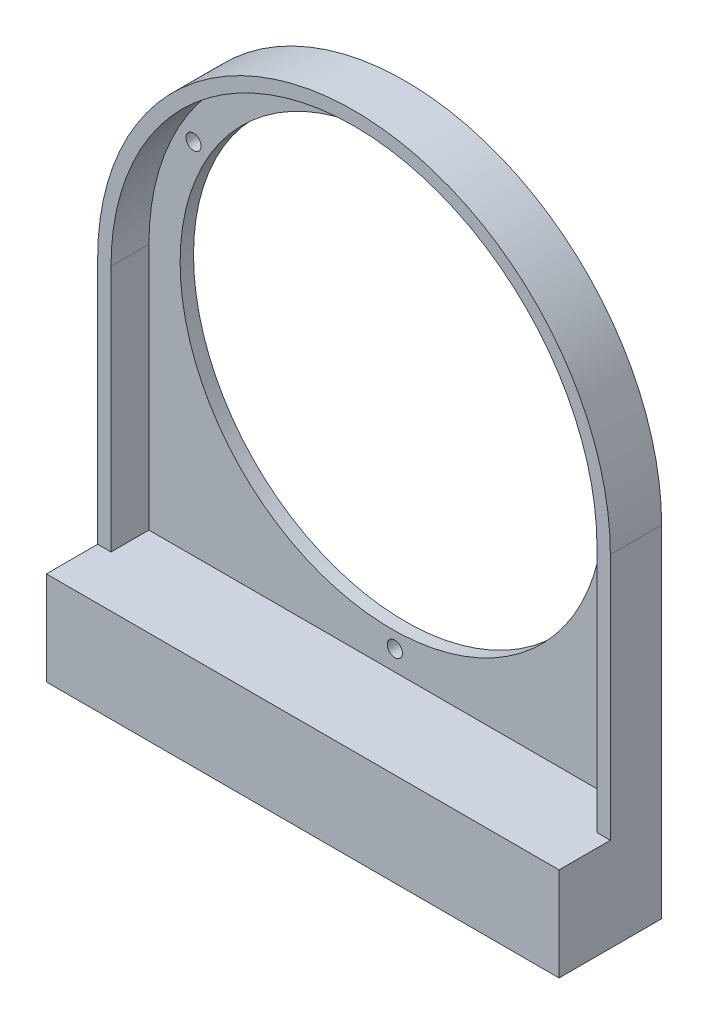
ISO-10303-21;
HEADER;
FILE_DESCRIPTION(('STEP AP214'),'2;1');
FILE_NAME('part.step','',(''),(''),'','','');
FILE_SCHEMA(('AUTOMOTIVE_DESIGN { 1 0 10303 214 1 1 1 1 }'));
ENDSEC;
DATA;
#1=APPLICATION_CONTEXT('core data for automotive mechanical design processes');
#2=APPLICATION_PROTOCOL_DEFINITION('international standard','automotive_design',2000,#1);
#3=PRODUCT_CONTEXT('',#1,'mechanical');
#4=PRODUCT('Part','Part','',(#3));
#5=PRODUCT_RELATED_PRODUCT_CATEGORY('part','',(#4));
#6=PRODUCT_DEFINITION_FORMATION('','',#4);
#7=PRODUCT_DEFINITION_CONTEXT('part definition',#1,'design');
#8=PRODUCT_DEFINITION('design','',#6,#7);
#9=PRODUCT_DEFINITION_SHAPE('','',#8);
#10=(LENGTH_UNIT() NAMED_UNIT(*) SI_UNIT(.MILLI.,.METRE.));
#11=(NAMED_UNIT(*) PLANE_ANGLE_UNIT() SI_UNIT($,.RADIAN.));
#12=(NAMED_UNIT(*) SI_UNIT($,.STERADIAN.) SOLID_ANGLE_UNIT());
#13=UNCERTAINTY_MEASURE_WITH_UNIT(LENGTH_MEASURE(1.E-05),#10,'distance_accuracy_value','');
#14=(GEOMETRIC_REPRESENTATION_CONTEXT(3) GLOBAL_UNCERTAINTY_ASSIGNED_CONTEXT((#13)) GLOBAL_UNIT_ASSIGNED_CONTEXT((#10,
#11,#12)) REPRESENTATION_CONTEXT('',''));
#15=CARTESIAN_POINT('',(0.,0.,0.));
#16=DIRECTION('',(0.,0.,1.));
#17=DIRECTION('',(1.,0.,0.));
#18=AXIS2_PLACEMENT_3D('',#15,#16,#17);
#19=CARTESIAN_POINT('',(0.,76.5,11.5));
#20=DIRECTION('',(0.,0.,-1.));
#21=DIRECTION('',(-1.,0.,0.));
#22=AXIS2_PLACEMENT_3D('',#19,#20,#21);
#23=PLANE('',#22);
#24=DIRECTION('',(0.,1.,0.));
#25=VECTOR('',#24,1.);
#26=CARTESIAN_POINT('',(-54.5,21.,11.5));
#27=LINE('',#26,#25);
#28=CARTESIAN_POINT('',(-54.5,21.,11.5));
#29=VERTEX_POINT('',#28);
#30=CARTESIAN_POINT('',(-54.5,76.5,11.5));
#31=VERTEX_POINT('',#30);
#32=EDGE_CURVE('E50',#29,#31,#27,.T.);
#33=ORIENTED_EDGE('',*,*,#32,.T.);
#34=CARTESIAN_POINT('',(0.,76.5,11.5));
#35=DIRECTION('',(0.,0.,-1.));
#36=DIRECTION('',(-1.,0.,0.));
#37=AXIS2_PLACEMENT_3D('',#34,#35,#36);
#38=CIRCLE('',#37,54.5);
#39=CARTESIAN_POINT('',(54.5,76.5,11.5));
#40=VERTEX_POINT('',#39);
#41=EDGE_CURVE('E132',#31,#40,#38,.T.);
#42=ORIENTED_EDGE('',*,*,#41,.T.);
#43=DIRECTION('',(0.,-1.,0.));
#44=VECTOR('',#43,1.);
#45=CARTESIAN_POINT('',(54.5,76.5,11.5));
#46=LINE('',#45,#44);
#47=CARTESIAN_POINT('',(54.5,21.,11.5));
#48=VERTEX_POINT('',#47);
#49=EDGE_CURVE('E128',#40,#48,#46,.T.);
#50=ORIENTED_EDGE('',*,*,#49,.T.);
#51=DIRECTION('',(-1.,0.,0.));
#52=VECTOR('',#51,1.);
#53=CARTESIAN_POINT('',(-57.5,21.,11.5));
#54=LINE('',#53,#52);
#55=CARTESIAN_POINT('',(57.5,21.,11.5));
#56=VERTEX_POINT('',#55);
#57=EDGE_CURVE('E58',#56,#48,#54,.T.);
#58=ORIENTED_EDGE('',*,*,#57,.F.);
#59=DIRECTION('',(0.,1.,0.));
#60=VECTOR('',#59,1.);
#61=CARTESIAN_POINT('',(57.5,76.5,11.5));
#62=LINE('',#61,#60);
#63=CARTESIAN_POINT('',(57.5,76.5,11.5));
#64=VERTEX_POINT('',#63);
#65=EDGE_CURVE('E229',#56,#64,#62,.T.);
#66=ORIENTED_EDGE('',*,*,#65,.T.);
#67=CARTESIAN_POINT('',(0.,76.5,11.5));
#68=DIRECTION('',(0.,0.,1.));
#69=DIRECTION('',(-1.,0.,0.));
#70=AXIS2_PLACEMENT_3D('',#67,#68,#69);
#71=CIRCLE('',#70,57.5);
#72=CARTESIAN_POINT('',(-57.5,76.5,11.5));
#73=VERTEX_POINT('',#72);
#74=EDGE_CURVE('E223',#64,#73,#71,.T.);
#75=ORIENTED_EDGE('',*,*,#74,.T.);
#76=DIRECTION('',(0.,-1.,0.));
#77=VECTOR('',#76,1.);
#78=CARTESIAN_POINT('',(-57.5,0.,11.5));
#79=LINE('',#78,#77);
#80=CARTESIAN_POINT('',(-57.5,21.,11.5));
#81=VERTEX_POINT('',#80);
#82=EDGE_CURVE('E220',#73,#81,#79,.T.);
#83=ORIENTED_EDGE('',*,*,#82,.T.);
#84=EDGE_CURVE('E133',#29,#81,#54,.T.);
#85=ORIENTED_EDGE('',*,*,#84,.F.);
#86=EDGE_LOOP('',(#33,#42,#50,#58,#66,#75,#83,#85));
#87=FACE_BOUND('',#86,.T.);
#88=ADVANCED_FACE('F33',(#87),#23,.F.);
#89=CARTESIAN_POINT('',(57.5,76.5,11.5));
#90=DIRECTION('',(-1.,0.,0.));
#91=DIRECTION('',(0.,0.,1.));
#92=AXIS2_PLACEMENT_3D('',#89,#90,#91);
#93=PLANE('',#92);
#94=DIRECTION('',(0.,1.,0.));
#95=VECTOR('',#94,1.);
#96=CARTESIAN_POINT('',(57.5,76.5,0.));
#97=LINE('',#96,#95);
#98=CARTESIAN_POINT('',(57.5,0.,0.));
#99=VERTEX_POINT('',#98);
#100=CARTESIAN_POINT('',(57.5,76.5,0.));
#101=VERTEX_POINT('',#100);
#102=EDGE_CURVE('E207',#99,#101,#97,.T.);
#103=ORIENTED_EDGE('',*,*,#102,.T.);
#104=DIRECTION('',(0.,0.,-1.));
#105=VECTOR('',#104,1.);
#106=CARTESIAN_POINT('',(57.5,76.5,11.5));
#107=LINE('',#106,#105);
#108=EDGE_CURVE('E11',#64,#101,#107,.T.);
#109=ORIENTED_EDGE('',*,*,#108,.F.);
#110=ORIENTED_EDGE('',*,*,#65,.F.);
#111=DIRECTION('',(0.,0.,-1.));
#112=VECTOR('',#111,1.);
#113=CARTESIAN_POINT('',(57.5,21.,23.));
#114=LINE('',#113,#112);
#115=CARTESIAN_POINT('',(57.5,21.,23.));
#116=VERTEX_POINT('',#115);
#117=EDGE_CURVE('E203',#116,#56,#114,.T.);
#118=ORIENTED_EDGE('',*,*,#117,.F.);
#119=DIRECTION('',(0.,1.,0.));
#120=VECTOR('',#119,1.);
#121=CARTESIAN_POINT('',(57.5,0.,23.));
#122=LINE('',#121,#120);
#123=CARTESIAN_POINT('',(57.5,0.,23.));
#124=VERTEX_POINT('',#123);
#125=EDGE_CURVE('E147',#124,#116,#122,.T.);
#126=ORIENTED_EDGE('',*,*,#125,.F.);
#127=DIRECTION('',(0.,0.,-1.));
#128=VECTOR('',#127,1.);
#129=CARTESIAN_POINT('',(57.5,0.,11.5));
#130=LINE('',#129,#128);
#131=EDGE_CURVE('E225',#124,#99,#130,.T.);
#132=ORIENTED_EDGE('',*,*,#131,.T.);
#133=EDGE_LOOP('',(#103,#109,#110,#118,#126,#132));
#134=FACE_BOUND('',#133,.T.);
#135=ADVANCED_FACE('F35',(#134),#93,.F.);
#136=CARTESIAN_POINT('',(0.,76.5,11.5));
#137=DIRECTION('',(0.,0.,-1.));
#138=DIRECTION('',(-1.,0.,0.));
#139=AXIS2_PLACEMENT_3D('',#136,#137,#138);
#140=CYLINDRICAL_SURFACE('',#139,57.5);
#141=CARTESIAN_POINT('',(0.,76.5,0.));
#142=DIRECTION('',(0.,0.,1.));
#143=DIRECTION('',(-1.,0.,0.));
#144=AXIS2_PLACEMENT_3D('',#141,#142,#143);
#145=CIRCLE('',#144,57.5);
#146=CARTESIAN_POINT('',(-57.5,76.5,0.));
#147=VERTEX_POINT('',#146);
#148=EDGE_CURVE('E209',#101,#147,#145,.T.);
#149=ORIENTED_EDGE('',*,*,#148,.T.);
#150=DIRECTION('',(0.,0.,-1.));
#151=VECTOR('',#150,1.);
#152=CARTESIAN_POINT('',(-57.5,76.5,11.5));
#153=LINE('',#152,#151);
#154=EDGE_CURVE('E42',#73,#147,#153,.T.);
#155=ORIENTED_EDGE('',*,*,#154,.F.);
#156=ORIENTED_EDGE('',*,*,#74,.F.);
#157=ORIENTED_EDGE('',*,*,#108,.T.);
#158=EDGE_LOOP('',(#149,#155,#156,#157));
#159=FACE_BOUND('',#158,.T.);
#160=ADVANCED_FACE('F266',(#159),#140,.T.);
#161=CARTESIAN_POINT('',(-57.5,0.,11.5));
#162=DIRECTION('',(1.,0.,0.));
#163=DIRECTION('',(0.,1.,0.));
#164=AXIS2_PLACEMENT_3D('',#161,#162,#163);
#165=PLANE('',#164);
#166=DIRECTION('',(0.,-1.,0.));
#167=VECTOR('',#166,1.);
#168=CARTESIAN_POINT('',(-57.5,0.,0.));
#169=LINE('',#168,#167);
#170=CARTESIAN_POINT('',(-57.5,0.,0.));
#171=VERTEX_POINT('',#170);
#172=EDGE_CURVE('E235',#147,#171,#169,.T.);
#173=ORIENTED_EDGE('',*,*,#172,.T.);
#174=DIRECTION('',(0.,0.,-1.));
#175=VECTOR('',#174,1.);
#176=CARTESIAN_POINT('',(-57.5,0.,11.5));
#177=LINE('',#176,#175);
#178=CARTESIAN_POINT('',(-57.5,0.,23.));
#179=VERTEX_POINT('',#178);
#180=EDGE_CURVE('E227',#179,#171,#177,.T.);
#181=ORIENTED_EDGE('',*,*,#180,.F.);
#182=DIRECTION('',(0.,-1.,0.));
#183=VECTOR('',#182,1.);
#184=CARTESIAN_POINT('',(-57.5,0.,23.));
#185=LINE('',#184,#183);
#186=CARTESIAN_POINT('',(-57.5,21.,23.));
#187=VERTEX_POINT('',#186);
#188=EDGE_CURVE('E141',#187,#179,#185,.T.);
#189=ORIENTED_EDGE('',*,*,#188,.F.);
#190=DIRECTION('',(0.,0.,-1.));
#191=VECTOR('',#190,1.);
#192=CARTESIAN_POINT('',(-57.5,21.,23.));
#193=LINE('',#192,#191);
#194=EDGE_CURVE('E151',#187,#81,#193,.T.);
#195=ORIENTED_EDGE('',*,*,#194,.T.);
#196=ORIENTED_EDGE('',*,*,#82,.F.);
#197=ORIENTED_EDGE('',*,*,#154,.T.);
#198=EDGE_LOOP('',(#173,#181,#189,#195,#196,#197));
#199=FACE_BOUND('',#198,.T.);
#200=ADVANCED_FACE('F217',(#199),#165,.F.);
#201=CARTESIAN_POINT('',(57.5,0.,11.5));
#202=DIRECTION('',(0.,1.,0.));
#203=DIRECTION('',(-1.,0.,0.));
#204=AXIS2_PLACEMENT_3D('',#201,#202,#203);
#205=PLANE('',#204);
#206=DIRECTION('',(1.,0.,0.));
#207=VECTOR('',#206,1.);
#208=CARTESIAN_POINT('',(57.5,0.,0.));
#209=LINE('',#208,#207);
#210=EDGE_CURVE('E237',#171,#99,#209,.T.);
#211=ORIENTED_EDGE('',*,*,#210,.T.);
#212=ORIENTED_EDGE('',*,*,#131,.F.);
#213=DIRECTION('',(1.,0.,0.));
#214=VECTOR('',#213,1.);
#215=CARTESIAN_POINT('',(-57.5,0.,23.));
#216=LINE('',#215,#214);
#217=EDGE_CURVE('E144',#179,#124,#216,.T.);
#218=ORIENTED_EDGE('',*,*,#217,.F.);
#219=ORIENTED_EDGE('',*,*,#180,.T.);
#220=EDGE_LOOP('',(#211,#212,#218,#219));
#221=FACE_BOUND('',#220,.T.);
#222=ADVANCED_FACE('F248',(#221),#205,.F.);
#223=CARTESIAN_POINT('',(0.,76.5,0.));
#224=DIRECTION('',(0.,0.,-1.));
#225=DIRECTION('',(-1.,0.,0.));
#226=AXIS2_PLACEMENT_3D('',#223,#224,#225);
#227=PLANE('',#226);
#228=CARTESIAN_POINT('',(43.8350968851079,102.566919286199,0.));
#229=DIRECTION('',(0.,0.,-1.));
#230=DIRECTION('',(-1.,0.,0.));
#231=AXIS2_PLACEMENT_3D('',#228,#229,#230);
#232=CIRCLE('',#231,1.69999999999999);
#233=CARTESIAN_POINT('',(42.1350968851079,102.566919286199,0.));
#234=VERTEX_POINT('',#233);
#235=EDGE_CURVE('E183',#234,#234,#232,.T.);
#236=ORIENTED_EDGE('',*,*,#235,.F.);
#237=EDGE_LOOP('',(#236));
#238=FACE_BOUND('',#237,.T.);
#239=CARTESIAN_POINT('',(-44.4921627428008,101.428847836756,0.));
#240=DIRECTION('',(0.,0.,-1.));
#241=DIRECTION('',(-1.,0.,0.));
#242=AXIS2_PLACEMENT_3D('',#239,#240,#241);
#243=CIRCLE('',#242,1.69999999999999);
#244=CARTESIAN_POINT('',(-46.1921627428008,101.428847836756,0.));
#245=VERTEX_POINT('',#244);
#246=EDGE_CURVE('E173',#245,#245,#243,.T.);
#247=ORIENTED_EDGE('',*,*,#246,.F.);
#248=EDGE_LOOP('',(#247));
#249=FACE_BOUND('',#248,.T.);
#250=CARTESIAN_POINT('',(0.657065857692579,25.504232877045,0.));
#251=DIRECTION('',(0.,0.,-1.));
#252=DIRECTION('',(-1.,0.,0.));
#253=AXIS2_PLACEMENT_3D('',#250,#251,#252);
#254=CIRCLE('',#253,1.69999999999999);
#255=CARTESIAN_POINT('',(-1.04293414230741,25.504232877045,0.));
#256=VERTEX_POINT('',#255);
#257=EDGE_CURVE('E170',#256,#256,#254,.T.);
#258=ORIENTED_EDGE('',*,*,#257,.F.);
#259=EDGE_LOOP('',(#258));
#260=FACE_BOUND('',#259,.T.);
#261=CARTESIAN_POINT('',(0.,76.5,0.));
#262=DIRECTION('',(0.,0.,-1.));
#263=DIRECTION('',(-1.,0.,0.));
#264=AXIS2_PLACEMENT_3D('',#261,#262,#263);
#265=CIRCLE('',#264,47.5);
#266=CARTESIAN_POINT('',(-47.5,76.5,0.));
#267=VERTEX_POINT('',#266);
#268=EDGE_CURVE('E167',#267,#267,#265,.T.);
#269=ORIENTED_EDGE('',*,*,#268,.F.);
#270=EDGE_LOOP('',(#269));
#271=FACE_BOUND('',#270,.T.);
#272=ORIENTED_EDGE('',*,*,#102,.F.);
#273=ORIENTED_EDGE('',*,*,#210,.F.);
#274=ORIENTED_EDGE('',*,*,#172,.F.);
#275=ORIENTED_EDGE('',*,*,#148,.F.);
#276=EDGE_LOOP('',(#272,#273,#274,#275));
#277=FACE_BOUND('',#276,.T.);
#278=ADVANCED_FACE('F246',(#238,#249,#260,#271,#277),#227,.T.);
#279=CARTESIAN_POINT('',(-57.5,21.,23.));
#280=DIRECTION('',(0.,-1.,0.));
#281=DIRECTION('',(0.,0.,-1.));
#282=AXIS2_PLACEMENT_3D('',#279,#280,#281);
#283=PLANE('',#282);
#284=ORIENTED_EDGE('',*,*,#57,.T.);
#285=DIRECTION('',(0.,0.,1.));
#286=VECTOR('',#285,1.);
#287=CARTESIAN_POINT('',(54.5,21.,3.));
#288=LINE('',#287,#286);
#289=CARTESIAN_POINT('',(54.5,21.,3.));
#290=VERTEX_POINT('',#289);
#291=EDGE_CURVE('E137',#290,#48,#288,.T.);
#292=ORIENTED_EDGE('',*,*,#291,.F.);
#293=DIRECTION('',(-1.,0.,0.));
#294=VECTOR('',#293,1.);
#295=CARTESIAN_POINT('',(54.5,21.,3.));
#296=LINE('',#295,#294);
#297=CARTESIAN_POINT('',(-54.5,21.,3.));
#298=VERTEX_POINT('',#297);
#299=EDGE_CURVE('E189',#290,#298,#296,.T.);
#300=ORIENTED_EDGE('',*,*,#299,.T.);
#301=DIRECTION('',(0.,0.,1.));
#302=VECTOR('',#301,1.);
#303=CARTESIAN_POINT('',(-54.5,21.,3.));
#304=LINE('',#303,#302);
#305=EDGE_CURVE('E127',#298,#29,#304,.T.);
#306=ORIENTED_EDGE('',*,*,#305,.T.);
#307=ORIENTED_EDGE('',*,*,#84,.T.);
#308=ORIENTED_EDGE('',*,*,#194,.F.);
#309=DIRECTION('',(-1.,0.,0.));
#310=VECTOR('',#309,1.);
#311=CARTESIAN_POINT('',(-57.5,21.,23.));
#312=LINE('',#311,#310);
#313=EDGE_CURVE('E149',#116,#187,#312,.T.);
#314=ORIENTED_EDGE('',*,*,#313,.F.);
#315=ORIENTED_EDGE('',*,*,#117,.T.);
#316=EDGE_LOOP('',(#284,#292,#300,#306,#307,#308,#314,#315));
#317=FACE_BOUND('',#316,.T.);
#318=ADVANCED_FACE('F200',(#317),#283,.F.);
#319=CARTESIAN_POINT('',(0.,0.,23.));
#320=DIRECTION('',(0.,0.,-1.));
#321=DIRECTION('',(-1.,0.,0.));
#322=AXIS2_PLACEMENT_3D('',#319,#320,#321);
#323=PLANE('',#322);
#324=ORIENTED_EDGE('',*,*,#188,.T.);
#325=ORIENTED_EDGE('',*,*,#217,.T.);
#326=ORIENTED_EDGE('',*,*,#125,.T.);
#327=ORIENTED_EDGE('',*,*,#313,.T.);
#328=EDGE_LOOP('',(#324,#325,#326,#327));
#329=FACE_BOUND('',#328,.T.);
#330=ADVANCED_FACE('F252',(#329),#323,.F.);
#331=CARTESIAN_POINT('',(-54.5,21.,3.));
#332=DIRECTION('',(1.,0.,0.));
#333=DIRECTION('',(0.,1.,0.));
#334=AXIS2_PLACEMENT_3D('',#331,#332,#333);
#335=PLANE('',#334);
#336=ORIENTED_EDGE('',*,*,#32,.F.);
#337=ORIENTED_EDGE('',*,*,#305,.F.);
#338=DIRECTION('',(0.,1.,0.));
#339=VECTOR('',#338,1.);
#340=CARTESIAN_POINT('',(-54.5,21.,3.));
#341=LINE('',#340,#339);
#342=CARTESIAN_POINT('',(-54.5,76.5,3.));
#343=VERTEX_POINT('',#342);
#344=EDGE_CURVE('E119',#298,#343,#341,.T.);
#345=ORIENTED_EDGE('',*,*,#344,.T.);
#346=DIRECTION('',(0.,0.,1.));
#347=VECTOR('',#346,1.);
#348=CARTESIAN_POINT('',(-54.5,76.5,3.));
#349=LINE('',#348,#347);
#350=EDGE_CURVE('E126',#343,#31,#349,.T.);
#351=ORIENTED_EDGE('',*,*,#350,.T.);
#352=EDGE_LOOP('',(#336,#337,#345,#351));
#353=FACE_BOUND('',#352,.T.);
#354=ADVANCED_FACE('F125',(#353),#335,.T.);
#355=CARTESIAN_POINT('',(0.,76.5,3.));
#356=DIRECTION('',(0.,0.,1.));
#357=DIRECTION('',(1.,0.,0.));
#358=AXIS2_PLACEMENT_3D('',#355,#356,#357);
#359=CYLINDRICAL_SURFACE('',#358,54.5);
#360=ORIENTED_EDGE('',*,*,#41,.F.);
#361=ORIENTED_EDGE('',*,*,#350,.F.);
#362=CARTESIAN_POINT('',(0.,76.5,3.));
#363=DIRECTION('',(0.,0.,-1.));
#364=DIRECTION('',(-1.,0.,0.));
#365=AXIS2_PLACEMENT_3D('',#362,#363,#364);
#366=CIRCLE('',#365,54.5);
#367=CARTESIAN_POINT('',(54.5,76.5,3.));
#368=VERTEX_POINT('',#367);
#369=EDGE_CURVE('E115',#343,#368,#366,.T.);
#370=ORIENTED_EDGE('',*,*,#369,.T.);
#371=DIRECTION('',(0.,0.,1.));
#372=VECTOR('',#371,1.);
#373=CARTESIAN_POINT('',(54.5,76.5,3.));
#374=LINE('',#373,#372);
#375=EDGE_CURVE('E134',#368,#40,#374,.T.);
#376=ORIENTED_EDGE('',*,*,#375,.T.);
#377=EDGE_LOOP('',(#360,#361,#370,#376));
#378=FACE_BOUND('',#377,.T.);
#379=ADVANCED_FACE('F130',(#378),#359,.F.);
#380=CARTESIAN_POINT('',(54.5,76.5,3.));
#381=DIRECTION('',(-1.,0.,0.));
#382=DIRECTION('',(0.,-1.,0.));
#383=AXIS2_PLACEMENT_3D('',#380,#381,#382);
#384=PLANE('',#383);
#385=ORIENTED_EDGE('',*,*,#49,.F.);
#386=ORIENTED_EDGE('',*,*,#375,.F.);
#387=DIRECTION('',(0.,-1.,0.));
#388=VECTOR('',#387,1.);
#389=CARTESIAN_POINT('',(54.5,76.5,3.));
#390=LINE('',#389,#388);
#391=EDGE_CURVE('E120',#368,#290,#390,.T.);
#392=ORIENTED_EDGE('',*,*,#391,.T.);
#393=ORIENTED_EDGE('',*,*,#291,.T.);
#394=EDGE_LOOP('',(#385,#386,#392,#393));
#395=FACE_BOUND('',#394,.T.);
#396=ADVANCED_FACE('F197',(#395),#384,.T.);
#397=CARTESIAN_POINT('',(0.,76.5,3.));
#398=DIRECTION('',(0.,0.,-1.));
#399=DIRECTION('',(-1.,0.,0.));
#400=AXIS2_PLACEMENT_3D('',#397,#398,#399);
#401=PLANE('',#400);
#402=CARTESIAN_POINT('',(43.8350968851079,102.566919286199,3.));
#403=DIRECTION('',(0.,0.,-1.));
#404=DIRECTION('',(-1.,0.,0.));
#405=AXIS2_PLACEMENT_3D('',#402,#403,#404);
#406=CIRCLE('',#405,1.69999999999999);
#407=CARTESIAN_POINT('',(42.1350968851079,102.566919286199,3.));
#408=VERTEX_POINT('',#407);
#409=EDGE_CURVE('E37',#408,#408,#406,.T.);
#410=ORIENTED_EDGE('',*,*,#409,.T.);
#411=EDGE_LOOP('',(#410));
#412=FACE_BOUND('',#411,.T.);
#413=CARTESIAN_POINT('',(-44.4921627428008,101.428847836756,3.));
#414=DIRECTION('',(0.,0.,-1.));
#415=DIRECTION('',(-1.,0.,0.));
#416=AXIS2_PLACEMENT_3D('',#413,#414,#415);
#417=CIRCLE('',#416,1.69999999999999);
#418=CARTESIAN_POINT('',(-46.1921627428008,101.428847836756,3.));
#419=VERTEX_POINT('',#418);
#420=EDGE_CURVE('E171',#419,#419,#417,.T.);
#421=ORIENTED_EDGE('',*,*,#420,.T.);
#422=EDGE_LOOP('',(#421));
#423=FACE_BOUND('',#422,.T.);
#424=CARTESIAN_POINT('',(0.657065857692579,25.504232877045,3.));
#425=DIRECTION('',(0.,0.,-1.));
#426=DIRECTION('',(-1.,0.,0.));
#427=AXIS2_PLACEMENT_3D('',#424,#425,#426);
#428=CIRCLE('',#427,1.69999999999999);
#429=CARTESIAN_POINT('',(-1.04293414230741,25.504232877045,3.));
#430=VERTEX_POINT('',#429);
#431=EDGE_CURVE('E168',#430,#430,#428,.T.);
#432=ORIENTED_EDGE('',*,*,#431,.T.);
#433=EDGE_LOOP('',(#432));
#434=FACE_BOUND('',#433,.T.);
#435=CARTESIAN_POINT('',(0.,76.5,3.));
#436=DIRECTION('',(0.,0.,-1.));
#437=DIRECTION('',(-1.,0.,0.));
#438=AXIS2_PLACEMENT_3D('',#435,#436,#437);
#439=CIRCLE('',#438,47.5);
#440=CARTESIAN_POINT('',(-47.5,76.5,3.));
#441=VERTEX_POINT('',#440);
#442=EDGE_CURVE('E164',#441,#441,#439,.T.);
#443=ORIENTED_EDGE('',*,*,#442,.T.);
#444=EDGE_LOOP('',(#443));
#445=FACE_BOUND('',#444,.T.);
#446=ORIENTED_EDGE('',*,*,#344,.F.);
#447=ORIENTED_EDGE('',*,*,#299,.F.);
#448=ORIENTED_EDGE('',*,*,#391,.F.);
#449=ORIENTED_EDGE('',*,*,#369,.F.);
#450=EDGE_LOOP('',(#446,#447,#448,#449));
#451=FACE_BOUND('',#450,.T.);
#452=ADVANCED_FACE('F117',(#412,#423,#434,#445,#451),#401,.F.);
#453=CARTESIAN_POINT('',(0.,76.5,23.000025));
#454=DIRECTION('',(0.,0.,-1.));
#455=DIRECTION('',(-1.,0.,0.));
#456=AXIS2_PLACEMENT_3D('',#453,#454,#455);
#457=CYLINDRICAL_SURFACE('',#456,47.5);
#458=ORIENTED_EDGE('',*,*,#268,.T.);
#459=EDGE_LOOP('',(#458));
#460=FACE_BOUND('',#459,.T.);
#461=ORIENTED_EDGE('',*,*,#442,.F.);
#462=EDGE_LOOP('',(#461));
#463=FACE_BOUND('',#462,.T.);
#464=ADVANCED_FACE('F332',(#460,#463),#457,.F.);
#465=CARTESIAN_POINT('',(0.657065857692579,25.504232877045,0.));
#466=DIRECTION('',(0.,0.,-1.));
#467=DIRECTION('',(-1.,0.,0.));
#468=AXIS2_PLACEMENT_3D('',#465,#466,#467);
#469=CYLINDRICAL_SURFACE('',#468,1.69999999999999);
#470=ORIENTED_EDGE('',*,*,#257,.T.);
#471=EDGE_LOOP('',(#470));
#472=FACE_BOUND('',#471,.T.);
#473=ORIENTED_EDGE('',*,*,#431,.F.);
#474=EDGE_LOOP('',(#473));
#475=FACE_BOUND('',#474,.T.);
#476=ADVANCED_FACE('F336',(#472,#475),#469,.F.);
#477=CARTESIAN_POINT('',(-44.4921627428008,101.428847836756,0.));
#478=DIRECTION('',(0.,0.,-1.));
#479=DIRECTION('',(-1.,0.,0.));
#480=AXIS2_PLACEMENT_3D('',#477,#478,#479);
#481=CYLINDRICAL_SURFACE('',#480,1.69999999999999);
#482=ORIENTED_EDGE('',*,*,#246,.T.);
#483=EDGE_LOOP('',(#482));
#484=FACE_BOUND('',#483,.T.);
#485=ORIENTED_EDGE('',*,*,#420,.F.);
#486=EDGE_LOOP('',(#485));
#487=FACE_BOUND('',#486,.T.);
#488=ADVANCED_FACE('F348',(#484,#487),#481,.F.);
#489=CARTESIAN_POINT('',(43.8350968851079,102.566919286199,0.));
#490=DIRECTION('',(0.,0.,-1.));
#491=DIRECTION('',(-1.,0.,0.));
#492=AXIS2_PLACEMENT_3D('',#489,#490,#491);
#493=CYLINDRICAL_SURFACE('',#492,1.69999999999999);
#494=ORIENTED_EDGE('',*,*,#235,.T.);
#495=EDGE_LOOP('',(#494));
#496=FACE_BOUND('',#495,.T.);
#497=ORIENTED_EDGE('',*,*,#409,.F.);
#498=EDGE_LOOP('',(#497));
#499=FACE_BOUND('',#498,.T.);
#500=ADVANCED_FACE('F355',(#496,#499),#493,.F.);
#501=CLOSED_SHELL('',(#88,#135,#160,#200,#222,#278,#318,#330,#354,#379,#396,#452,#464,#476,#488,#500));
#502=MANIFOLD_SOLID_BREP('B2',#501);
#503=ADVANCED_BREP_SHAPE_REPRESENTATION('',(#18,#502),#14);
#504=SHAPE_DEFINITION_REPRESENTATION(#9,#503);
ENDSEC;
END-ISO-10303-21;
